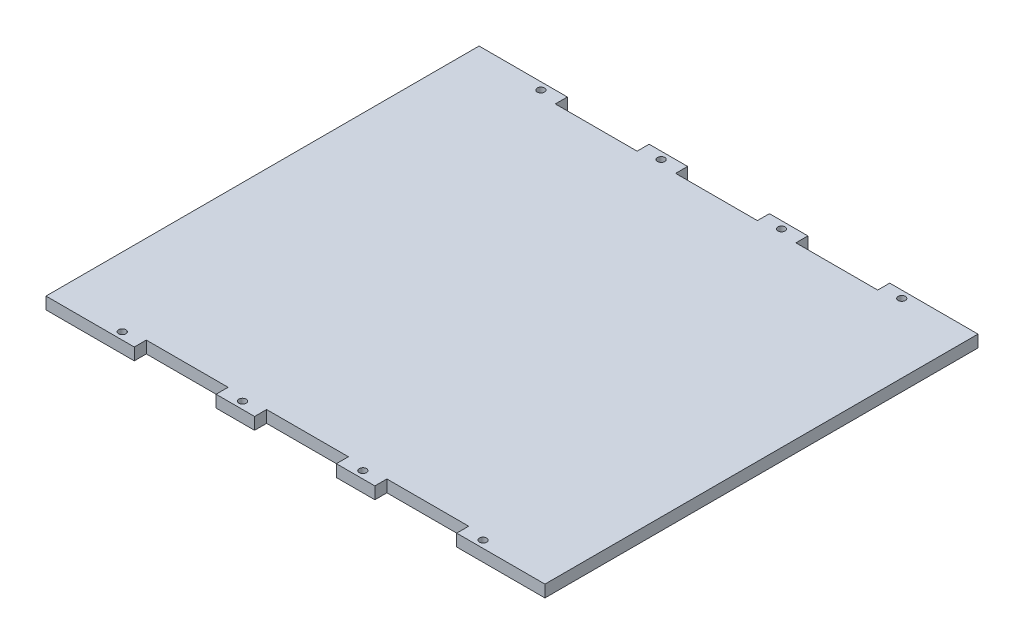
ISO-10303-21;
HEADER;
FILE_DESCRIPTION(('STEP AP214'),'2;1');
FILE_NAME('part.step','',(''),(''),'','','');
FILE_SCHEMA(('AUTOMOTIVE_DESIGN { 1 0 10303 214 1 1 1 1 }'));
ENDSEC;
DATA;
#1=APPLICATION_CONTEXT('core data for automotive mechanical design processes');
#2=APPLICATION_PROTOCOL_DEFINITION('international standard','automotive_design',2000,#1);
#3=PRODUCT_CONTEXT('',#1,'mechanical');
#4=PRODUCT('Part','Part','',(#3));
#5=PRODUCT_RELATED_PRODUCT_CATEGORY('part','',(#4));
#6=PRODUCT_DEFINITION_FORMATION('','',#4);
#7=PRODUCT_DEFINITION_CONTEXT('part definition',#1,'design');
#8=PRODUCT_DEFINITION('design','',#6,#7);
#9=PRODUCT_DEFINITION_SHAPE('','',#8);
#10=(LENGTH_UNIT() NAMED_UNIT(*) SI_UNIT(.MILLI.,.METRE.));
#11=(NAMED_UNIT(*) PLANE_ANGLE_UNIT() SI_UNIT($,.RADIAN.));
#12=(NAMED_UNIT(*) SI_UNIT($,.STERADIAN.) SOLID_ANGLE_UNIT());
#13=UNCERTAINTY_MEASURE_WITH_UNIT(LENGTH_MEASURE(1.E-05),#10,'distance_accuracy_value','');
#14=(GEOMETRIC_REPRESENTATION_CONTEXT(3) GLOBAL_UNCERTAINTY_ASSIGNED_CONTEXT((#13)) GLOBAL_UNIT_ASSIGNED_CONTEXT((#10,
#11,#12)) REPRESENTATION_CONTEXT('',''));
#15=CARTESIAN_POINT('',(0.,0.,0.));
#16=DIRECTION('',(0.,0.,1.));
#17=DIRECTION('',(1.,0.,0.));
#18=AXIS2_PLACEMENT_3D('',#15,#16,#17);
#19=CARTESIAN_POINT('',(0.,5.,0.));
#20=DIRECTION('',(0.,1.,0.));
#21=DIRECTION('',(0.,0.,1.));
#22=AXIS2_PLACEMENT_3D('',#19,#20,#21);
#23=PLANE('',#22);
#24=CARTESIAN_POINT('',(-75.,5.,-87.));
#25=DIRECTION('',(0.,-1.,0.));
#26=DIRECTION('',(0.,0.,-1.));
#27=AXIS2_PLACEMENT_3D('',#24,#25,#26);
#28=CIRCLE('',#27,1.5);
#29=CARTESIAN_POINT('',(-75.,5.,-88.5));
#30=VERTEX_POINT('',#29);
#31=EDGE_CURVE('E273',#30,#30,#28,.T.);
#32=ORIENTED_EDGE('',*,*,#31,.T.);
#33=EDGE_LOOP('',(#32));
#34=FACE_BOUND('',#33,.T.);
#35=CARTESIAN_POINT('',(-25.,5.,-87.));
#36=DIRECTION('',(0.,-1.,0.));
#37=DIRECTION('',(0.,0.,-1.));
#38=AXIS2_PLACEMENT_3D('',#35,#36,#37);
#39=CIRCLE('',#38,1.5);
#40=CARTESIAN_POINT('',(-25.,5.,-88.5));
#41=VERTEX_POINT('',#40);
#42=EDGE_CURVE('E279',#41,#41,#39,.T.);
#43=ORIENTED_EDGE('',*,*,#42,.T.);
#44=EDGE_LOOP('',(#43));
#45=FACE_BOUND('',#44,.T.);
#46=CARTESIAN_POINT('',(25.,5.,-87.));
#47=DIRECTION('',(0.,-1.,0.));
#48=DIRECTION('',(0.,0.,-1.));
#49=AXIS2_PLACEMENT_3D('',#46,#47,#48);
#50=CIRCLE('',#49,1.5);
#51=CARTESIAN_POINT('',(25.,5.,-88.5));
#52=VERTEX_POINT('',#51);
#53=EDGE_CURVE('E285',#52,#52,#50,.T.);
#54=ORIENTED_EDGE('',*,*,#53,.T.);
#55=EDGE_LOOP('',(#54));
#56=FACE_BOUND('',#55,.T.);
#57=CARTESIAN_POINT('',(75.,5.,-87.));
#58=DIRECTION('',(0.,-1.,0.));
#59=DIRECTION('',(0.,0.,-1.));
#60=AXIS2_PLACEMENT_3D('',#57,#58,#59);
#61=CIRCLE('',#60,1.5);
#62=CARTESIAN_POINT('',(75.,5.,-88.5));
#63=VERTEX_POINT('',#62);
#64=EDGE_CURVE('E266',#63,#63,#61,.T.);
#65=ORIENTED_EDGE('',*,*,#64,.T.);
#66=EDGE_LOOP('',(#65));
#67=FACE_BOUND('',#66,.T.);
#68=CARTESIAN_POINT('',(-75.,5.,87.));
#69=DIRECTION('',(0.,1.,0.));
#70=DIRECTION('',(0.,0.,1.));
#71=AXIS2_PLACEMENT_3D('',#68,#69,#70);
#72=CIRCLE('',#71,1.5);
#73=CARTESIAN_POINT('',(-75.,5.,88.5));
#74=VERTEX_POINT('',#73);
#75=EDGE_CURVE('E297',#74,#74,#72,.T.);
#76=ORIENTED_EDGE('',*,*,#75,.F.);
#77=EDGE_LOOP('',(#76));
#78=FACE_BOUND('',#77,.T.);
#79=CARTESIAN_POINT('',(-25.,5.,87.));
#80=DIRECTION('',(0.,1.,0.));
#81=DIRECTION('',(0.,0.,1.));
#82=AXIS2_PLACEMENT_3D('',#79,#80,#81);
#83=CIRCLE('',#82,1.5);
#84=CARTESIAN_POINT('',(-25.,5.,88.5));
#85=VERTEX_POINT('',#84);
#86=EDGE_CURVE('E303',#85,#85,#83,.T.);
#87=ORIENTED_EDGE('',*,*,#86,.F.);
#88=EDGE_LOOP('',(#87));
#89=FACE_BOUND('',#88,.T.);
#90=CARTESIAN_POINT('',(25.,5.,87.));
#91=DIRECTION('',(0.,1.,0.));
#92=DIRECTION('',(0.,0.,1.));
#93=AXIS2_PLACEMENT_3D('',#90,#91,#92);
#94=CIRCLE('',#93,1.5);
#95=CARTESIAN_POINT('',(25.,5.,88.5));
#96=VERTEX_POINT('',#95);
#97=EDGE_CURVE('E309',#96,#96,#94,.T.);
#98=ORIENTED_EDGE('',*,*,#97,.F.);
#99=EDGE_LOOP('',(#98));
#100=FACE_BOUND('',#99,.T.);
#101=CARTESIAN_POINT('',(75.,5.,87.));
#102=DIRECTION('',(0.,1.,0.));
#103=DIRECTION('',(0.,0.,1.));
#104=AXIS2_PLACEMENT_3D('',#101,#102,#103);
#105=CIRCLE('',#104,1.5);
#106=CARTESIAN_POINT('',(75.,5.,88.5));
#107=VERTEX_POINT('',#106);
#108=EDGE_CURVE('E272',#107,#107,#105,.T.);
#109=ORIENTED_EDGE('',*,*,#108,.F.);
#110=EDGE_LOOP('',(#109));
#111=FACE_BOUND('',#110,.T.);
#112=DIRECTION('',(-1.,0.,0.));
#113=VECTOR('',#112,1.);
#114=CARTESIAN_POINT('',(100.,5.,-90.));
#115=LINE('',#114,#113);
#116=CARTESIAN_POINT('',(-67.,5.,-90.));
#117=VERTEX_POINT('',#116);
#118=CARTESIAN_POINT('',(-103.69,5.,-90.));
#119=VERTEX_POINT('',#118);
#120=EDGE_CURVE('E49',#117,#119,#115,.T.);
#121=ORIENTED_EDGE('',*,*,#120,.T.);
#122=DIRECTION('',(0.,0.,-1.));
#123=VECTOR('',#122,1.);
#124=CARTESIAN_POINT('',(-103.69,5.,-90.));
#125=LINE('',#124,#123);
#126=CARTESIAN_POINT('',(-103.69,5.,90.));
#127=VERTEX_POINT('',#126);
#128=EDGE_CURVE('E246',#127,#119,#125,.T.);
#129=ORIENTED_EDGE('',*,*,#128,.F.);
#130=DIRECTION('',(1.,0.,0.));
#131=VECTOR('',#130,1.);
#132=CARTESIAN_POINT('',(100.,5.,90.));
#133=LINE('',#132,#131);
#134=CARTESIAN_POINT('',(-67.,5.,90.));
#135=VERTEX_POINT('',#134);
#136=EDGE_CURVE('E464',#127,#135,#133,.T.);
#137=ORIENTED_EDGE('',*,*,#136,.T.);
#138=DIRECTION('',(0.,0.,-1.));
#139=VECTOR('',#138,1.);
#140=CARTESIAN_POINT('',(-67.0000000000003,5.,1.85962356624714E-13));
#141=LINE('',#140,#139);
#142=CARTESIAN_POINT('',(-67.,5.,85.));
#143=VERTEX_POINT('',#142);
#144=EDGE_CURVE('E434',#135,#143,#141,.T.);
#145=ORIENTED_EDGE('',*,*,#144,.T.);
#146=DIRECTION('',(1.,0.,0.));
#147=VECTOR('',#146,1.);
#148=CARTESIAN_POINT('',(0.,5.,85.));
#149=LINE('',#148,#147);
#150=CARTESIAN_POINT('',(-33.,5.,85.));
#151=VERTEX_POINT('',#150);
#152=EDGE_CURVE('E431',#143,#151,#149,.T.);
#153=ORIENTED_EDGE('',*,*,#152,.T.);
#154=DIRECTION('',(0.,0.,-1.));
#155=VECTOR('',#154,1.);
#156=CARTESIAN_POINT('',(-33.,5.,0.));
#157=LINE('',#156,#155);
#158=CARTESIAN_POINT('',(-33.,5.,90.));
#159=VERTEX_POINT('',#158);
#160=EDGE_CURVE('E425',#159,#151,#157,.T.);
#161=ORIENTED_EDGE('',*,*,#160,.F.);
#162=CARTESIAN_POINT('',(-17.,5.,90.));
#163=VERTEX_POINT('',#162);
#164=EDGE_CURVE('E490',#159,#163,#133,.T.);
#165=ORIENTED_EDGE('',*,*,#164,.T.);
#166=DIRECTION('',(0.,0.,-1.));
#167=VECTOR('',#166,1.);
#168=CARTESIAN_POINT('',(-17.0000000000001,5.,0.));
#169=LINE('',#168,#167);
#170=CARTESIAN_POINT('',(-17.,5.,85.));
#171=VERTEX_POINT('',#170);
#172=EDGE_CURVE('E452',#163,#171,#169,.T.);
#173=ORIENTED_EDGE('',*,*,#172,.T.);
#174=DIRECTION('',(1.,0.,0.));
#175=VECTOR('',#174,1.);
#176=CARTESIAN_POINT('',(0.,5.,85.));
#177=LINE('',#176,#175);
#178=CARTESIAN_POINT('',(17.,5.,85.));
#179=VERTEX_POINT('',#178);
#180=EDGE_CURVE('E406',#171,#179,#177,.T.);
#181=ORIENTED_EDGE('',*,*,#180,.T.);
#182=DIRECTION('',(0.,0.,-1.));
#183=VECTOR('',#182,1.);
#184=CARTESIAN_POINT('',(17.0000000000001,5.,0.));
#185=LINE('',#184,#183);
#186=CARTESIAN_POINT('',(17.,5.,90.));
#187=VERTEX_POINT('',#186);
#188=EDGE_CURVE('E369',#187,#179,#185,.T.);
#189=ORIENTED_EDGE('',*,*,#188,.F.);
#190=CARTESIAN_POINT('',(33.,5.,90.));
#191=VERTEX_POINT('',#190);
#192=EDGE_CURVE('E463',#187,#191,#133,.T.);
#193=ORIENTED_EDGE('',*,*,#192,.T.);
#194=DIRECTION('',(0.,0.,-1.));
#195=VECTOR('',#194,1.);
#196=CARTESIAN_POINT('',(33.,5.,0.));
#197=LINE('',#196,#195);
#198=CARTESIAN_POINT('',(33.,5.,85.));
#199=VERTEX_POINT('',#198);
#200=EDGE_CURVE('E398',#191,#199,#197,.T.);
#201=ORIENTED_EDGE('',*,*,#200,.T.);
#202=DIRECTION('',(-1.,0.,0.));
#203=VECTOR('',#202,1.);
#204=CARTESIAN_POINT('',(0.,5.,85.));
#205=LINE('',#204,#203);
#206=CARTESIAN_POINT('',(67.,5.,85.));
#207=VERTEX_POINT('',#206);
#208=EDGE_CURVE('E395',#207,#199,#205,.T.);
#209=ORIENTED_EDGE('',*,*,#208,.F.);
#210=DIRECTION('',(0.,0.,-1.));
#211=VECTOR('',#210,1.);
#212=CARTESIAN_POINT('',(67.0000000000003,5.,1.85962356624714E-13));
#213=LINE('',#212,#211);
#214=CARTESIAN_POINT('',(67.,5.,90.));
#215=VERTEX_POINT('',#214);
#216=EDGE_CURVE('E389',#215,#207,#213,.T.);
#217=ORIENTED_EDGE('',*,*,#216,.F.);
#218=CARTESIAN_POINT('',(103.69,5.,90.));
#219=VERTEX_POINT('',#218);
#220=EDGE_CURVE('E462',#215,#219,#133,.T.);
#221=ORIENTED_EDGE('',*,*,#220,.T.);
#222=DIRECTION('',(0.,0.,-1.));
#223=VECTOR('',#222,1.);
#224=CARTESIAN_POINT('',(103.69,5.,-90.));
#225=LINE('',#224,#223);
#226=CARTESIAN_POINT('',(103.69,5.,-90.));
#227=VERTEX_POINT('',#226);
#228=EDGE_CURVE('E253',#219,#227,#225,.T.);
#229=ORIENTED_EDGE('',*,*,#228,.T.);
#230=CARTESIAN_POINT('',(67.,5.,-90.));
#231=VERTEX_POINT('',#230);
#232=EDGE_CURVE('E11',#227,#231,#115,.T.);
#233=ORIENTED_EDGE('',*,*,#232,.T.);
#234=DIRECTION('',(0.,0.,1.));
#235=VECTOR('',#234,1.);
#236=CARTESIAN_POINT('',(67.0000000000003,5.,-1.85962356624714E-13));
#237=LINE('',#236,#235);
#238=CARTESIAN_POINT('',(67.,5.,-85.));
#239=VERTEX_POINT('',#238);
#240=EDGE_CURVE('E361',#231,#239,#237,.T.);
#241=ORIENTED_EDGE('',*,*,#240,.T.);
#242=DIRECTION('',(-1.,0.,0.));
#243=VECTOR('',#242,1.);
#244=CARTESIAN_POINT('',(0.,5.,-85.));
#245=LINE('',#244,#243);
#246=CARTESIAN_POINT('',(33.,5.,-85.));
#247=VERTEX_POINT('',#246);
#248=EDGE_CURVE('E358',#239,#247,#245,.T.);
#249=ORIENTED_EDGE('',*,*,#248,.T.);
#250=DIRECTION('',(0.,0.,1.));
#251=VECTOR('',#250,1.);
#252=CARTESIAN_POINT('',(33.,5.,0.));
#253=LINE('',#252,#251);
#254=CARTESIAN_POINT('',(33.,5.,-90.));
#255=VERTEX_POINT('',#254);
#256=EDGE_CURVE('E352',#255,#247,#253,.T.);
#257=ORIENTED_EDGE('',*,*,#256,.F.);
#258=CARTESIAN_POINT('',(17.,5.,-90.));
#259=VERTEX_POINT('',#258);
#260=EDGE_CURVE('E47',#255,#259,#115,.T.);
#261=ORIENTED_EDGE('',*,*,#260,.T.);
#262=DIRECTION('',(0.,0.,1.));
#263=VECTOR('',#262,1.);
#264=CARTESIAN_POINT('',(17.0000000000001,5.,0.));
#265=LINE('',#264,#263);
#266=CARTESIAN_POINT('',(17.,5.,-85.));
#267=VERTEX_POINT('',#266);
#268=EDGE_CURVE('E64',#259,#267,#265,.T.);
#269=ORIENTED_EDGE('',*,*,#268,.T.);
#270=DIRECTION('',(-1.,0.,0.));
#271=VECTOR('',#270,1.);
#272=CARTESIAN_POINT('',(0.,5.,-85.));
#273=LINE('',#272,#271);
#274=CARTESIAN_POINT('',(-17.,5.,-85.));
#275=VERTEX_POINT('',#274);
#276=EDGE_CURVE('E335',#267,#275,#273,.T.);
#277=ORIENTED_EDGE('',*,*,#276,.T.);
#278=DIRECTION('',(0.,0.,1.));
#279=VECTOR('',#278,1.);
#280=CARTESIAN_POINT('',(-17.0000000000001,5.,0.));
#281=LINE('',#280,#279);
#282=CARTESIAN_POINT('',(-17.,5.,-90.));
#283=VERTEX_POINT('',#282);
#284=EDGE_CURVE('E296',#283,#275,#281,.T.);
#285=ORIENTED_EDGE('',*,*,#284,.F.);
#286=CARTESIAN_POINT('',(-33.,5.,-90.));
#287=VERTEX_POINT('',#286);
#288=EDGE_CURVE('E465',#283,#287,#115,.T.);
#289=ORIENTED_EDGE('',*,*,#288,.T.);
#290=DIRECTION('',(0.,0.,1.));
#291=VECTOR('',#290,1.);
#292=CARTESIAN_POINT('',(-33.,5.,0.));
#293=LINE('',#292,#291);
#294=CARTESIAN_POINT('',(-33.,5.,-85.));
#295=VERTEX_POINT('',#294);
#296=EDGE_CURVE('E56',#287,#295,#293,.T.);
#297=ORIENTED_EDGE('',*,*,#296,.T.);
#298=DIRECTION('',(1.,0.,0.));
#299=VECTOR('',#298,1.);
#300=CARTESIAN_POINT('',(0.,5.,-85.));
#301=LINE('',#300,#299);
#302=CARTESIAN_POINT('',(-67.,5.,-85.));
#303=VERTEX_POINT('',#302);
#304=EDGE_CURVE('E326',#303,#295,#301,.T.);
#305=ORIENTED_EDGE('',*,*,#304,.F.);
#306=DIRECTION('',(0.,0.,1.));
#307=VECTOR('',#306,1.);
#308=CARTESIAN_POINT('',(-67.0000000000003,5.,-1.85962356624714E-13));
#309=LINE('',#308,#307);
#310=EDGE_CURVE('E321',#117,#303,#309,.T.);
#311=ORIENTED_EDGE('',*,*,#310,.F.);
#312=EDGE_LOOP('',(#121,#129,#137,#145,#153,#161,#165,#173,#181,#189,#193,#201,#209,#217,#221,
#229,#233,#241,#249,#257,#261,#269,#277,#285,#289,#297,#305,#311));
#313=FACE_BOUND('',#312,.T.);
#314=ADVANCED_FACE('F38',(#34,#45,#56,#67,#78,#89,#100,#111,#313),#23,.T.);
#315=CARTESIAN_POINT('',(0.,0.,0.));
#316=DIRECTION('',(0.,1.,0.));
#317=DIRECTION('',(0.,0.,1.));
#318=AXIS2_PLACEMENT_3D('',#315,#316,#317);
#319=PLANE('',#318);
#320=CARTESIAN_POINT('',(-75.,0.,-87.));
#321=DIRECTION('',(0.,-1.,0.));
#322=DIRECTION('',(0.,0.,-1.));
#323=AXIS2_PLACEMENT_3D('',#320,#321,#322);
#324=CIRCLE('',#323,1.5);
#325=CARTESIAN_POINT('',(-75.,0.,-88.5));
#326=VERTEX_POINT('',#325);
#327=EDGE_CURVE('E269',#326,#326,#324,.T.);
#328=ORIENTED_EDGE('',*,*,#327,.F.);
#329=EDGE_LOOP('',(#328));
#330=FACE_BOUND('',#329,.T.);
#331=CARTESIAN_POINT('',(-25.,0.,-87.));
#332=DIRECTION('',(0.,-1.,0.));
#333=DIRECTION('',(0.,0.,-1.));
#334=AXIS2_PLACEMENT_3D('',#331,#332,#333);
#335=CIRCLE('',#334,1.5);
#336=CARTESIAN_POINT('',(-25.,0.,-88.5));
#337=VERTEX_POINT('',#336);
#338=EDGE_CURVE('E276',#337,#337,#335,.T.);
#339=ORIENTED_EDGE('',*,*,#338,.F.);
#340=EDGE_LOOP('',(#339));
#341=FACE_BOUND('',#340,.T.);
#342=CARTESIAN_POINT('',(25.,0.,-87.));
#343=DIRECTION('',(0.,-1.,0.));
#344=DIRECTION('',(0.,0.,-1.));
#345=AXIS2_PLACEMENT_3D('',#342,#343,#344);
#346=CIRCLE('',#345,1.5);
#347=CARTESIAN_POINT('',(25.,0.,-88.5));
#348=VERTEX_POINT('',#347);
#349=EDGE_CURVE('E282',#348,#348,#346,.T.);
#350=ORIENTED_EDGE('',*,*,#349,.F.);
#351=EDGE_LOOP('',(#350));
#352=FACE_BOUND('',#351,.T.);
#353=CARTESIAN_POINT('',(75.,0.,-87.));
#354=DIRECTION('',(0.,-1.,0.));
#355=DIRECTION('',(0.,0.,-1.));
#356=AXIS2_PLACEMENT_3D('',#353,#354,#355);
#357=CIRCLE('',#356,1.5);
#358=CARTESIAN_POINT('',(75.,0.,-88.5));
#359=VERTEX_POINT('',#358);
#360=EDGE_CURVE('E288',#359,#359,#357,.T.);
#361=ORIENTED_EDGE('',*,*,#360,.F.);
#362=EDGE_LOOP('',(#361));
#363=FACE_BOUND('',#362,.T.);
#364=CARTESIAN_POINT('',(-75.,0.,87.));
#365=DIRECTION('',(0.,1.,0.));
#366=DIRECTION('',(0.,0.,1.));
#367=AXIS2_PLACEMENT_3D('',#364,#365,#366);
#368=CIRCLE('',#367,1.5);
#369=CARTESIAN_POINT('',(-75.,0.,88.5));
#370=VERTEX_POINT('',#369);
#371=EDGE_CURVE('E293',#370,#370,#368,.T.);
#372=ORIENTED_EDGE('',*,*,#371,.T.);
#373=EDGE_LOOP('',(#372));
#374=FACE_BOUND('',#373,.T.);
#375=CARTESIAN_POINT('',(-25.,0.,87.));
#376=DIRECTION('',(0.,1.,0.));
#377=DIRECTION('',(0.,0.,1.));
#378=AXIS2_PLACEMENT_3D('',#375,#376,#377);
#379=CIRCLE('',#378,1.5);
#380=CARTESIAN_POINT('',(-25.,0.,88.5));
#381=VERTEX_POINT('',#380);
#382=EDGE_CURVE('E300',#381,#381,#379,.T.);
#383=ORIENTED_EDGE('',*,*,#382,.T.);
#384=EDGE_LOOP('',(#383));
#385=FACE_BOUND('',#384,.T.);
#386=CARTESIAN_POINT('',(25.,0.,87.));
#387=DIRECTION('',(0.,1.,0.));
#388=DIRECTION('',(0.,0.,1.));
#389=AXIS2_PLACEMENT_3D('',#386,#387,#388);
#390=CIRCLE('',#389,1.5);
#391=CARTESIAN_POINT('',(25.,0.,88.5));
#392=VERTEX_POINT('',#391);
#393=EDGE_CURVE('E306',#392,#392,#390,.T.);
#394=ORIENTED_EDGE('',*,*,#393,.T.);
#395=EDGE_LOOP('',(#394));
#396=FACE_BOUND('',#395,.T.);
#397=CARTESIAN_POINT('',(75.,0.,87.));
#398=DIRECTION('',(0.,1.,0.));
#399=DIRECTION('',(0.,0.,1.));
#400=AXIS2_PLACEMENT_3D('',#397,#398,#399);
#401=CIRCLE('',#400,1.5);
#402=CARTESIAN_POINT('',(75.,0.,88.5));
#403=VERTEX_POINT('',#402);
#404=EDGE_CURVE('E312',#403,#403,#401,.T.);
#405=ORIENTED_EDGE('',*,*,#404,.T.);
#406=EDGE_LOOP('',(#405));
#407=FACE_BOUND('',#406,.T.);
#408=DIRECTION('',(1.,0.,0.));
#409=VECTOR('',#408,1.);
#410=CARTESIAN_POINT('',(100.,0.,90.));
#411=LINE('',#410,#409);
#412=CARTESIAN_POINT('',(-103.69,0.,90.));
#413=VERTEX_POINT('',#412);
#414=CARTESIAN_POINT('',(-67.,0.,90.));
#415=VERTEX_POINT('',#414);
#416=EDGE_CURVE('E236',#413,#415,#411,.T.);
#417=ORIENTED_EDGE('',*,*,#416,.F.);
#418=DIRECTION('',(0.,0.,-1.));
#419=VECTOR('',#418,1.);
#420=CARTESIAN_POINT('',(-103.69,0.,-90.));
#421=LINE('',#420,#419);
#422=CARTESIAN_POINT('',(-103.69,0.,-90.));
#423=VERTEX_POINT('',#422);
#424=EDGE_CURVE('E239',#413,#423,#421,.T.);
#425=ORIENTED_EDGE('',*,*,#424,.T.);
#426=DIRECTION('',(-1.,0.,0.));
#427=VECTOR('',#426,1.);
#428=CARTESIAN_POINT('',(100.,0.,-90.));
#429=LINE('',#428,#427);
#430=CARTESIAN_POINT('',(-67.,0.,-90.));
#431=VERTEX_POINT('',#430);
#432=EDGE_CURVE('E42',#431,#423,#429,.T.);
#433=ORIENTED_EDGE('',*,*,#432,.F.);
#434=DIRECTION('',(0.,0.,1.));
#435=VECTOR('',#434,1.);
#436=CARTESIAN_POINT('',(-67.0000000000003,0.,-1.85962356624714E-13));
#437=LINE('',#436,#435);
#438=CARTESIAN_POINT('',(-67.,0.,-85.));
#439=VERTEX_POINT('',#438);
#440=EDGE_CURVE('E323',#431,#439,#437,.T.);
#441=ORIENTED_EDGE('',*,*,#440,.T.);
#442=DIRECTION('',(1.,0.,0.));
#443=VECTOR('',#442,1.);
#444=CARTESIAN_POINT('',(0.,0.,-85.));
#445=LINE('',#444,#443);
#446=CARTESIAN_POINT('',(-33.,0.,-85.));
#447=VERTEX_POINT('',#446);
#448=EDGE_CURVE('E317',#439,#447,#445,.T.);
#449=ORIENTED_EDGE('',*,*,#448,.T.);
#450=DIRECTION('',(0.,0.,1.));
#451=VECTOR('',#450,1.);
#452=CARTESIAN_POINT('',(-33.,0.,0.));
#453=LINE('',#452,#451);
#454=CARTESIAN_POINT('',(-33.,0.,-90.));
#455=VERTEX_POINT('',#454);
#456=EDGE_CURVE('E320',#455,#447,#453,.T.);
#457=ORIENTED_EDGE('',*,*,#456,.F.);
#458=CARTESIAN_POINT('',(-17.,0.,-90.));
#459=VERTEX_POINT('',#458);
#460=EDGE_CURVE('E235',#459,#455,#429,.T.);
#461=ORIENTED_EDGE('',*,*,#460,.F.);
#462=DIRECTION('',(0.,0.,1.));
#463=VECTOR('',#462,1.);
#464=CARTESIAN_POINT('',(-17.0000000000001,0.,0.));
#465=LINE('',#464,#463);
#466=CARTESIAN_POINT('',(-17.,0.,-85.));
#467=VERTEX_POINT('',#466);
#468=EDGE_CURVE('E340',#459,#467,#465,.T.);
#469=ORIENTED_EDGE('',*,*,#468,.T.);
#470=DIRECTION('',(-1.,0.,0.));
#471=VECTOR('',#470,1.);
#472=CARTESIAN_POINT('',(0.,0.,-85.));
#473=LINE('',#472,#471);
#474=CARTESIAN_POINT('',(17.,0.,-85.));
#475=VERTEX_POINT('',#474);
#476=EDGE_CURVE('E376',#475,#467,#473,.T.);
#477=ORIENTED_EDGE('',*,*,#476,.F.);
#478=DIRECTION('',(0.,0.,1.));
#479=VECTOR('',#478,1.);
#480=CARTESIAN_POINT('',(17.0000000000001,0.,0.));
#481=LINE('',#480,#479);
#482=CARTESIAN_POINT('',(17.,0.,-90.));
#483=VERTEX_POINT('',#482);
#484=EDGE_CURVE('E378',#483,#475,#481,.T.);
#485=ORIENTED_EDGE('',*,*,#484,.F.);
#486=CARTESIAN_POINT('',(33.,0.,-90.));
#487=VERTEX_POINT('',#486);
#488=EDGE_CURVE('E1028',#487,#483,#429,.T.);
#489=ORIENTED_EDGE('',*,*,#488,.F.);
#490=DIRECTION('',(0.,0.,1.));
#491=VECTOR('',#490,1.);
#492=CARTESIAN_POINT('',(33.,0.,0.));
#493=LINE('',#492,#491);
#494=CARTESIAN_POINT('',(33.,0.,-85.));
#495=VERTEX_POINT('',#494);
#496=EDGE_CURVE('E354',#487,#495,#493,.T.);
#497=ORIENTED_EDGE('',*,*,#496,.T.);
#498=DIRECTION('',(-1.,0.,0.));
#499=VECTOR('',#498,1.);
#500=CARTESIAN_POINT('',(0.,0.,-85.));
#501=LINE('',#500,#499);
#502=CARTESIAN_POINT('',(67.,0.,-85.));
#503=VERTEX_POINT('',#502);
#504=EDGE_CURVE('E349',#503,#495,#501,.T.);
#505=ORIENTED_EDGE('',*,*,#504,.F.);
#506=DIRECTION('',(0.,0.,1.));
#507=VECTOR('',#506,1.);
#508=CARTESIAN_POINT('',(67.0000000000003,0.,-1.85962356624714E-13));
#509=LINE('',#508,#507);
#510=CARTESIAN_POINT('',(67.,0.,-90.));
#511=VERTEX_POINT('',#510);
#512=EDGE_CURVE('E351',#511,#503,#509,.T.);
#513=ORIENTED_EDGE('',*,*,#512,.F.);
#514=CARTESIAN_POINT('',(103.69,0.,-90.));
#515=VERTEX_POINT('',#514);
#516=EDGE_CURVE('E237',#515,#511,#429,.T.);
#517=ORIENTED_EDGE('',*,*,#516,.F.);
#518=DIRECTION('',(0.,0.,-1.));
#519=VECTOR('',#518,1.);
#520=CARTESIAN_POINT('',(103.69,0.,-90.));
#521=LINE('',#520,#519);
#522=CARTESIAN_POINT('',(103.69,0.,90.));
#523=VERTEX_POINT('',#522);
#524=EDGE_CURVE('E257',#523,#515,#521,.T.);
#525=ORIENTED_EDGE('',*,*,#524,.F.);
#526=CARTESIAN_POINT('',(67.,0.,90.));
#527=VERTEX_POINT('',#526);
#528=EDGE_CURVE('E442',#527,#523,#411,.T.);
#529=ORIENTED_EDGE('',*,*,#528,.F.);
#530=DIRECTION('',(0.,0.,-1.));
#531=VECTOR('',#530,1.);
#532=CARTESIAN_POINT('',(67.0000000000003,0.,1.85962356624714E-13));
#533=LINE('',#532,#531);
#534=CARTESIAN_POINT('',(67.,0.,85.));
#535=VERTEX_POINT('',#534);
#536=EDGE_CURVE('E391',#527,#535,#533,.T.);
#537=ORIENTED_EDGE('',*,*,#536,.T.);
#538=DIRECTION('',(-1.,0.,0.));
#539=VECTOR('',#538,1.);
#540=CARTESIAN_POINT('',(0.,0.,85.));
#541=LINE('',#540,#539);
#542=CARTESIAN_POINT('',(33.,0.,85.));
#543=VERTEX_POINT('',#542);
#544=EDGE_CURVE('E385',#535,#543,#541,.T.);
#545=ORIENTED_EDGE('',*,*,#544,.T.);
#546=DIRECTION('',(0.,0.,-1.));
#547=VECTOR('',#546,1.);
#548=CARTESIAN_POINT('',(33.,0.,0.));
#549=LINE('',#548,#547);
#550=CARTESIAN_POINT('',(33.,0.,90.));
#551=VERTEX_POINT('',#550);
#552=EDGE_CURVE('E388',#551,#543,#549,.T.);
#553=ORIENTED_EDGE('',*,*,#552,.F.);
#554=CARTESIAN_POINT('',(17.,0.,90.));
#555=VERTEX_POINT('',#554);
#556=EDGE_CURVE('E466',#555,#551,#411,.T.);
#557=ORIENTED_EDGE('',*,*,#556,.F.);
#558=DIRECTION('',(0.,0.,-1.));
#559=VECTOR('',#558,1.);
#560=CARTESIAN_POINT('',(17.0000000000001,0.,0.));
#561=LINE('',#560,#559);
#562=CARTESIAN_POINT('',(17.,0.,85.));
#563=VERTEX_POINT('',#562);
#564=EDGE_CURVE('E413',#555,#563,#561,.T.);
#565=ORIENTED_EDGE('',*,*,#564,.T.);
#566=DIRECTION('',(1.,0.,0.));
#567=VECTOR('',#566,1.);
#568=CARTESIAN_POINT('',(0.,0.,85.));
#569=LINE('',#568,#567);
#570=CARTESIAN_POINT('',(-17.,0.,85.));
#571=VERTEX_POINT('',#570);
#572=EDGE_CURVE('E449',#571,#563,#569,.T.);
#573=ORIENTED_EDGE('',*,*,#572,.F.);
#574=DIRECTION('',(0.,0.,-1.));
#575=VECTOR('',#574,1.);
#576=CARTESIAN_POINT('',(-17.0000000000001,0.,0.));
#577=LINE('',#576,#575);
#578=CARTESIAN_POINT('',(-17.,0.,90.));
#579=VERTEX_POINT('',#578);
#580=EDGE_CURVE('E451',#579,#571,#577,.T.);
#581=ORIENTED_EDGE('',*,*,#580,.F.);
#582=CARTESIAN_POINT('',(-33.,0.,90.));
#583=VERTEX_POINT('',#582);
#584=EDGE_CURVE('E472',#583,#579,#411,.T.);
#585=ORIENTED_EDGE('',*,*,#584,.F.);
#586=DIRECTION('',(0.,0.,-1.));
#587=VECTOR('',#586,1.);
#588=CARTESIAN_POINT('',(-33.,0.,0.));
#589=LINE('',#588,#587);
#590=CARTESIAN_POINT('',(-33.,0.,85.));
#591=VERTEX_POINT('',#590);
#592=EDGE_CURVE('E427',#583,#591,#589,.T.);
#593=ORIENTED_EDGE('',*,*,#592,.T.);
#594=DIRECTION('',(1.,0.,0.));
#595=VECTOR('',#594,1.);
#596=CARTESIAN_POINT('',(0.,0.,85.));
#597=LINE('',#596,#595);
#598=CARTESIAN_POINT('',(-67.,0.,85.));
#599=VERTEX_POINT('',#598);
#600=EDGE_CURVE('E422',#599,#591,#597,.T.);
#601=ORIENTED_EDGE('',*,*,#600,.F.);
#602=DIRECTION('',(0.,0.,-1.));
#603=VECTOR('',#602,1.);
#604=CARTESIAN_POINT('',(-67.0000000000003,0.,1.85962356624714E-13));
#605=LINE('',#604,#603);
#606=EDGE_CURVE('E424',#415,#599,#605,.T.);
#607=ORIENTED_EDGE('',*,*,#606,.F.);
#608=EDGE_LOOP('',(#417,#425,#433,#441,#449,#457,#461,#469,#477,#485,#489,#497,#505,#513,#517,
#525,#529,#537,#545,#553,#557,#565,#573,#581,#585,#593,#601,#607));
#609=FACE_BOUND('',#608,.T.);
#610=ADVANCED_FACE('F240',(#330,#341,#352,#363,#374,#385,#396,#407,#609),#319,.F.);
#611=CARTESIAN_POINT('',(100.,5.,-90.));
#612=DIRECTION('',(0.,0.,1.));
#613=DIRECTION('',(1.,0.,0.));
#614=AXIS2_PLACEMENT_3D('',#611,#612,#613);
#615=PLANE('',#614);
#616=ORIENTED_EDGE('',*,*,#432,.T.);
#617=DIRECTION('',(0.,1.,0.));
#618=VECTOR('',#617,1.);
#619=CARTESIAN_POINT('',(-103.69,0.,-90.));
#620=LINE('',#619,#618);
#621=EDGE_CURVE('E231',#423,#119,#620,.T.);
#622=ORIENTED_EDGE('',*,*,#621,.T.);
#623=ORIENTED_EDGE('',*,*,#120,.F.);
#624=DIRECTION('',(0.,1.,0.));
#625=VECTOR('',#624,1.);
#626=CARTESIAN_POINT('',(-67.,0.,-90.));
#627=LINE('',#626,#625);
#628=EDGE_CURVE('E232',#431,#117,#627,.T.);
#629=ORIENTED_EDGE('',*,*,#628,.F.);
#630=EDGE_LOOP('',(#616,#622,#623,#629));
#631=FACE_BOUND('',#630,.T.);
#632=ADVANCED_FACE('F228',(#631),#615,.F.);
#633=DIRECTION('',(0.,1.,0.));
#634=VECTOR('',#633,1.);
#635=CARTESIAN_POINT('',(-33.,0.,-90.));
#636=LINE('',#635,#634);
#637=EDGE_CURVE('E337',#455,#287,#636,.T.);
#638=ORIENTED_EDGE('',*,*,#637,.T.);
#639=ORIENTED_EDGE('',*,*,#288,.F.);
#640=DIRECTION('',(0.,1.,0.));
#641=VECTOR('',#640,1.);
#642=CARTESIAN_POINT('',(-17.,0.,-90.));
#643=LINE('',#642,#641);
#644=EDGE_CURVE('E343',#459,#283,#643,.T.);
#645=ORIENTED_EDGE('',*,*,#644,.F.);
#646=ORIENTED_EDGE('',*,*,#460,.T.);
#647=EDGE_LOOP('',(#638,#639,#645,#646));
#648=FACE_BOUND('',#647,.T.);
#649=ADVANCED_FACE('F543',(#648),#615,.F.);
#650=ORIENTED_EDGE('',*,*,#232,.F.);
#651=DIRECTION('',(0.,1.,0.));
#652=VECTOR('',#651,1.);
#653=CARTESIAN_POINT('',(103.69,0.,-90.));
#654=LINE('',#653,#652);
#655=EDGE_CURVE('E263',#515,#227,#654,.T.);
#656=ORIENTED_EDGE('',*,*,#655,.F.);
#657=ORIENTED_EDGE('',*,*,#516,.T.);
#658=DIRECTION('',(0.,1.,0.));
#659=VECTOR('',#658,1.);
#660=CARTESIAN_POINT('',(67.,0.,-90.));
#661=LINE('',#660,#659);
#662=EDGE_CURVE('E372',#511,#231,#661,.T.);
#663=ORIENTED_EDGE('',*,*,#662,.T.);
#664=EDGE_LOOP('',(#650,#656,#657,#663));
#665=FACE_BOUND('',#664,.T.);
#666=ADVANCED_FACE('F516',(#665),#615,.F.);
#667=ORIENTED_EDGE('',*,*,#260,.F.);
#668=DIRECTION('',(0.,1.,0.));
#669=VECTOR('',#668,1.);
#670=CARTESIAN_POINT('',(33.,0.,-90.));
#671=LINE('',#670,#669);
#672=EDGE_CURVE('E370',#487,#255,#671,.T.);
#673=ORIENTED_EDGE('',*,*,#672,.F.);
#674=ORIENTED_EDGE('',*,*,#488,.T.);
#675=DIRECTION('',(0.,1.,0.));
#676=VECTOR('',#675,1.);
#677=CARTESIAN_POINT('',(17.,0.,-90.));
#678=LINE('',#677,#676);
#679=EDGE_CURVE('E362',#483,#259,#678,.T.);
#680=ORIENTED_EDGE('',*,*,#679,.T.);
#681=EDGE_LOOP('',(#667,#673,#674,#680));
#682=FACE_BOUND('',#681,.T.);
#683=ADVANCED_FACE('F535',(#682),#615,.F.);
#684=CARTESIAN_POINT('',(100.,5.,90.));
#685=DIRECTION('',(0.,0.,-1.));
#686=DIRECTION('',(-1.,0.,0.));
#687=AXIS2_PLACEMENT_3D('',#684,#685,#686);
#688=PLANE('',#687);
#689=ORIENTED_EDGE('',*,*,#528,.T.);
#690=DIRECTION('',(0.,1.,0.));
#691=VECTOR('',#690,1.);
#692=CARTESIAN_POINT('',(103.69,0.,90.));
#693=LINE('',#692,#691);
#694=EDGE_CURVE('E260',#523,#219,#693,.T.);
#695=ORIENTED_EDGE('',*,*,#694,.T.);
#696=ORIENTED_EDGE('',*,*,#220,.F.);
#697=DIRECTION('',(0.,1.,0.));
#698=VECTOR('',#697,1.);
#699=CARTESIAN_POINT('',(67.,0.,90.));
#700=LINE('',#699,#698);
#701=EDGE_CURVE('E407',#527,#215,#700,.T.);
#702=ORIENTED_EDGE('',*,*,#701,.F.);
#703=EDGE_LOOP('',(#689,#695,#696,#702));
#704=FACE_BOUND('',#703,.T.);
#705=ADVANCED_FACE('F509',(#704),#688,.F.);
#706=DIRECTION('',(0.,1.,0.));
#707=VECTOR('',#706,1.);
#708=CARTESIAN_POINT('',(33.,0.,90.));
#709=LINE('',#708,#707);
#710=EDGE_CURVE('E409',#551,#191,#709,.T.);
#711=ORIENTED_EDGE('',*,*,#710,.T.);
#712=ORIENTED_EDGE('',*,*,#192,.F.);
#713=DIRECTION('',(0.,1.,0.));
#714=VECTOR('',#713,1.);
#715=CARTESIAN_POINT('',(17.,0.,90.));
#716=LINE('',#715,#714);
#717=EDGE_CURVE('E416',#555,#187,#716,.T.);
#718=ORIENTED_EDGE('',*,*,#717,.F.);
#719=ORIENTED_EDGE('',*,*,#556,.T.);
#720=EDGE_LOOP('',(#711,#712,#718,#719));
#721=FACE_BOUND('',#720,.T.);
#722=ADVANCED_FACE('F497',(#721),#688,.F.);
#723=ORIENTED_EDGE('',*,*,#136,.F.);
#724=DIRECTION('',(0.,1.,0.));
#725=VECTOR('',#724,1.);
#726=CARTESIAN_POINT('',(-103.69,0.,90.));
#727=LINE('',#726,#725);
#728=EDGE_CURVE('E251',#413,#127,#727,.T.);
#729=ORIENTED_EDGE('',*,*,#728,.F.);
#730=ORIENTED_EDGE('',*,*,#416,.T.);
#731=DIRECTION('',(0.,1.,0.));
#732=VECTOR('',#731,1.);
#733=CARTESIAN_POINT('',(-67.,0.,90.));
#734=LINE('',#733,#732);
#735=EDGE_CURVE('E445',#415,#135,#734,.T.);
#736=ORIENTED_EDGE('',*,*,#735,.T.);
#737=EDGE_LOOP('',(#723,#729,#730,#736));
#738=FACE_BOUND('',#737,.T.);
#739=ADVANCED_FACE('F40',(#738),#688,.F.);
#740=ORIENTED_EDGE('',*,*,#164,.F.);
#741=DIRECTION('',(0.,1.,0.));
#742=VECTOR('',#741,1.);
#743=CARTESIAN_POINT('',(-33.,0.,90.));
#744=LINE('',#743,#742);
#745=EDGE_CURVE('E443',#583,#159,#744,.T.);
#746=ORIENTED_EDGE('',*,*,#745,.F.);
#747=ORIENTED_EDGE('',*,*,#584,.T.);
#748=DIRECTION('',(0.,1.,0.));
#749=VECTOR('',#748,1.);
#750=CARTESIAN_POINT('',(-17.,0.,90.));
#751=LINE('',#750,#749);
#752=EDGE_CURVE('E435',#579,#163,#751,.T.);
#753=ORIENTED_EDGE('',*,*,#752,.T.);
#754=EDGE_LOOP('',(#740,#746,#747,#753));
#755=FACE_BOUND('',#754,.T.);
#756=ADVANCED_FACE('F479',(#755),#688,.F.);
#757=CARTESIAN_POINT('',(-17.0000000000001,0.,0.));
#758=DIRECTION('',(1.,0.,0.));
#759=DIRECTION('',(0.,0.,-1.));
#760=AXIS2_PLACEMENT_3D('',#757,#758,#759);
#761=PLANE('',#760);
#762=ORIENTED_EDGE('',*,*,#172,.F.);
#763=ORIENTED_EDGE('',*,*,#752,.F.);
#764=ORIENTED_EDGE('',*,*,#580,.T.);
#765=DIRECTION('',(0.,1.,0.));
#766=VECTOR('',#765,1.);
#767=CARTESIAN_POINT('',(-17.,0.,85.));
#768=LINE('',#767,#766);
#769=EDGE_CURVE('E455',#571,#171,#768,.T.);
#770=ORIENTED_EDGE('',*,*,#769,.T.);
#771=EDGE_LOOP('',(#762,#763,#764,#770));
#772=FACE_BOUND('',#771,.T.);
#773=ADVANCED_FACE('F485',(#772),#761,.T.);
#774=CARTESIAN_POINT('',(0.,0.,85.));
#775=DIRECTION('',(0.,0.,1.));
#776=DIRECTION('',(1.,0.,0.));
#777=AXIS2_PLACEMENT_3D('',#774,#775,#776);
#778=PLANE('',#777);
#779=ORIENTED_EDGE('',*,*,#180,.F.);
#780=ORIENTED_EDGE('',*,*,#769,.F.);
#781=ORIENTED_EDGE('',*,*,#572,.T.);
#782=DIRECTION('',(0.,1.,0.));
#783=VECTOR('',#782,1.);
#784=CARTESIAN_POINT('',(17.,0.,85.));
#785=LINE('',#784,#783);
#786=EDGE_CURVE('E399',#563,#179,#785,.T.);
#787=ORIENTED_EDGE('',*,*,#786,.T.);
#788=EDGE_LOOP('',(#779,#780,#781,#787));
#789=FACE_BOUND('',#788,.T.);
#790=ADVANCED_FACE('F576',(#789),#778,.T.);
#791=CARTESIAN_POINT('',(0.,0.,85.));
#792=DIRECTION('',(0.,0.,1.));
#793=DIRECTION('',(1.,0.,0.));
#794=AXIS2_PLACEMENT_3D('',#791,#792,#793);
#795=PLANE('',#794);
#796=ORIENTED_EDGE('',*,*,#152,.F.);
#797=DIRECTION('',(0.,1.,0.));
#798=VECTOR('',#797,1.);
#799=CARTESIAN_POINT('',(-67.,0.,85.));
#800=LINE('',#799,#798);
#801=EDGE_CURVE('E430',#599,#143,#800,.T.);
#802=ORIENTED_EDGE('',*,*,#801,.F.);
#803=ORIENTED_EDGE('',*,*,#600,.T.);
#804=DIRECTION('',(0.,1.,0.));
#805=VECTOR('',#804,1.);
#806=CARTESIAN_POINT('',(-33.,0.,85.));
#807=LINE('',#806,#805);
#808=EDGE_CURVE('E440',#591,#151,#807,.T.);
#809=ORIENTED_EDGE('',*,*,#808,.T.);
#810=EDGE_LOOP('',(#796,#802,#803,#809));
#811=FACE_BOUND('',#810,.T.);
#812=ADVANCED_FACE('F841',(#811),#795,.T.);
#813=CARTESIAN_POINT('',(-33.,0.,0.));
#814=DIRECTION('',(1.,0.,0.));
#815=DIRECTION('',(0.,0.,-1.));
#816=AXIS2_PLACEMENT_3D('',#813,#814,#815);
#817=PLANE('',#816);
#818=ORIENTED_EDGE('',*,*,#160,.T.);
#819=ORIENTED_EDGE('',*,*,#808,.F.);
#820=ORIENTED_EDGE('',*,*,#592,.F.);
#821=ORIENTED_EDGE('',*,*,#745,.T.);
#822=EDGE_LOOP('',(#818,#819,#820,#821));
#823=FACE_BOUND('',#822,.T.);
#824=ADVANCED_FACE('F848',(#823),#817,.F.);
#825=CARTESIAN_POINT('',(-67.0000000000003,0.,1.85962356624714E-13));
#826=DIRECTION('',(1.,0.,0.));
#827=DIRECTION('',(0.,0.,-1.));
#828=AXIS2_PLACEMENT_3D('',#825,#826,#827);
#829=PLANE('',#828);
#830=ORIENTED_EDGE('',*,*,#144,.F.);
#831=ORIENTED_EDGE('',*,*,#735,.F.);
#832=ORIENTED_EDGE('',*,*,#606,.T.);
#833=ORIENTED_EDGE('',*,*,#801,.T.);
#834=EDGE_LOOP('',(#830,#831,#832,#833));
#835=FACE_BOUND('',#834,.T.);
#836=ADVANCED_FACE('F856',(#835),#829,.T.);
#837=CARTESIAN_POINT('',(17.0000000000001,0.,0.));
#838=DIRECTION('',(1.,0.,0.));
#839=DIRECTION('',(0.,0.,-1.));
#840=AXIS2_PLACEMENT_3D('',#837,#838,#839);
#841=PLANE('',#840);
#842=ORIENTED_EDGE('',*,*,#188,.T.);
#843=ORIENTED_EDGE('',*,*,#786,.F.);
#844=ORIENTED_EDGE('',*,*,#564,.F.);
#845=ORIENTED_EDGE('',*,*,#717,.T.);
#846=EDGE_LOOP('',(#842,#843,#844,#845));
#847=FACE_BOUND('',#846,.T.);
#848=ADVANCED_FACE('F864',(#847),#841,.F.);
#849=CARTESIAN_POINT('',(0.,0.,85.));
#850=DIRECTION('',(0.,0.,-1.));
#851=DIRECTION('',(-1.,0.,0.));
#852=AXIS2_PLACEMENT_3D('',#849,#850,#851);
#853=PLANE('',#852);
#854=ORIENTED_EDGE('',*,*,#208,.T.);
#855=DIRECTION('',(0.,1.,0.));
#856=VECTOR('',#855,1.);
#857=CARTESIAN_POINT('',(33.,0.,85.));
#858=LINE('',#857,#856);
#859=EDGE_CURVE('E394',#543,#199,#858,.T.);
#860=ORIENTED_EDGE('',*,*,#859,.F.);
#861=ORIENTED_EDGE('',*,*,#544,.F.);
#862=DIRECTION('',(0.,1.,0.));
#863=VECTOR('',#862,1.);
#864=CARTESIAN_POINT('',(67.,0.,85.));
#865=LINE('',#864,#863);
#866=EDGE_CURVE('E404',#535,#207,#865,.T.);
#867=ORIENTED_EDGE('',*,*,#866,.T.);
#868=EDGE_LOOP('',(#854,#860,#861,#867));
#869=FACE_BOUND('',#868,.T.);
#870=ADVANCED_FACE('F505',(#869),#853,.F.);
#871=CARTESIAN_POINT('',(67.0000000000003,0.,1.85962356624714E-13));
#872=DIRECTION('',(1.,0.,0.));
#873=DIRECTION('',(0.,0.,-1.));
#874=AXIS2_PLACEMENT_3D('',#871,#872,#873);
#875=PLANE('',#874);
#876=ORIENTED_EDGE('',*,*,#216,.T.);
#877=ORIENTED_EDGE('',*,*,#866,.F.);
#878=ORIENTED_EDGE('',*,*,#536,.F.);
#879=ORIENTED_EDGE('',*,*,#701,.T.);
#880=EDGE_LOOP('',(#876,#877,#878,#879));
#881=FACE_BOUND('',#880,.T.);
#882=ADVANCED_FACE('F878',(#881),#875,.F.);
#883=CARTESIAN_POINT('',(33.,0.,0.));
#884=DIRECTION('',(1.,0.,0.));
#885=DIRECTION('',(0.,0.,-1.));
#886=AXIS2_PLACEMENT_3D('',#883,#884,#885);
#887=PLANE('',#886);
#888=ORIENTED_EDGE('',*,*,#200,.F.);
#889=ORIENTED_EDGE('',*,*,#710,.F.);
#890=ORIENTED_EDGE('',*,*,#552,.T.);
#891=ORIENTED_EDGE('',*,*,#859,.T.);
#892=EDGE_LOOP('',(#888,#889,#890,#891));
#893=FACE_BOUND('',#892,.T.);
#894=ADVANCED_FACE('F501',(#893),#887,.T.);
#895=CARTESIAN_POINT('',(17.0000000000001,0.,0.));
#896=DIRECTION('',(-1.,0.,0.));
#897=DIRECTION('',(0.,0.,1.));
#898=AXIS2_PLACEMENT_3D('',#895,#896,#897);
#899=PLANE('',#898);
#900=ORIENTED_EDGE('',*,*,#268,.F.);
#901=ORIENTED_EDGE('',*,*,#679,.F.);
#902=ORIENTED_EDGE('',*,*,#484,.T.);
#903=DIRECTION('',(0.,1.,0.));
#904=VECTOR('',#903,1.);
#905=CARTESIAN_POINT('',(17.,0.,-85.));
#906=LINE('',#905,#904);
#907=EDGE_CURVE('E380',#475,#267,#906,.T.);
#908=ORIENTED_EDGE('',*,*,#907,.T.);
#909=EDGE_LOOP('',(#900,#901,#902,#908));
#910=FACE_BOUND('',#909,.T.);
#911=ADVANCED_FACE('F612',(#910),#899,.T.);
#912=CARTESIAN_POINT('',(0.,0.,-85.));
#913=DIRECTION('',(0.,0.,-1.));
#914=DIRECTION('',(-1.,0.,0.));
#915=AXIS2_PLACEMENT_3D('',#912,#913,#914);
#916=PLANE('',#915);
#917=ORIENTED_EDGE('',*,*,#276,.F.);
#918=ORIENTED_EDGE('',*,*,#907,.F.);
#919=ORIENTED_EDGE('',*,*,#476,.T.);
#920=DIRECTION('',(0.,1.,0.));
#921=VECTOR('',#920,1.);
#922=CARTESIAN_POINT('',(-17.,0.,-85.));
#923=LINE('',#922,#921);
#924=EDGE_CURVE('E329',#467,#275,#923,.T.);
#925=ORIENTED_EDGE('',*,*,#924,.T.);
#926=EDGE_LOOP('',(#917,#918,#919,#925));
#927=FACE_BOUND('',#926,.T.);
#928=ADVANCED_FACE('F617',(#927),#916,.T.);
#929=CARTESIAN_POINT('',(0.,0.,-85.));
#930=DIRECTION('',(0.,0.,-1.));
#931=DIRECTION('',(-1.,0.,0.));
#932=AXIS2_PLACEMENT_3D('',#929,#930,#931);
#933=PLANE('',#932);
#934=ORIENTED_EDGE('',*,*,#248,.F.);
#935=DIRECTION('',(0.,1.,0.));
#936=VECTOR('',#935,1.);
#937=CARTESIAN_POINT('',(67.,0.,-85.));
#938=LINE('',#937,#936);
#939=EDGE_CURVE('E357',#503,#239,#938,.T.);
#940=ORIENTED_EDGE('',*,*,#939,.F.);
#941=ORIENTED_EDGE('',*,*,#504,.T.);
#942=DIRECTION('',(0.,1.,0.));
#943=VECTOR('',#942,1.);
#944=CARTESIAN_POINT('',(33.,0.,-85.));
#945=LINE('',#944,#943);
#946=EDGE_CURVE('E367',#495,#247,#945,.T.);
#947=ORIENTED_EDGE('',*,*,#946,.T.);
#948=EDGE_LOOP('',(#934,#940,#941,#947));
#949=FACE_BOUND('',#948,.T.);
#950=ADVANCED_FACE('F527',(#949),#933,.T.);
#951=CARTESIAN_POINT('',(33.,0.,0.));
#952=DIRECTION('',(-1.,0.,0.));
#953=DIRECTION('',(0.,0.,1.));
#954=AXIS2_PLACEMENT_3D('',#951,#952,#953);
#955=PLANE('',#954);
#956=ORIENTED_EDGE('',*,*,#256,.T.);
#957=ORIENTED_EDGE('',*,*,#946,.F.);
#958=ORIENTED_EDGE('',*,*,#496,.F.);
#959=ORIENTED_EDGE('',*,*,#672,.T.);
#960=EDGE_LOOP('',(#956,#957,#958,#959));
#961=FACE_BOUND('',#960,.T.);
#962=ADVANCED_FACE('F529',(#961),#955,.F.);
#963=CARTESIAN_POINT('',(67.0000000000003,0.,-1.85962356624714E-13));
#964=DIRECTION('',(-1.,0.,0.));
#965=DIRECTION('',(0.,0.,1.));
#966=AXIS2_PLACEMENT_3D('',#963,#964,#965);
#967=PLANE('',#966);
#968=ORIENTED_EDGE('',*,*,#240,.F.);
#969=ORIENTED_EDGE('',*,*,#662,.F.);
#970=ORIENTED_EDGE('',*,*,#512,.T.);
#971=ORIENTED_EDGE('',*,*,#939,.T.);
#972=EDGE_LOOP('',(#968,#969,#970,#971));
#973=FACE_BOUND('',#972,.T.);
#974=ADVANCED_FACE('F520',(#973),#967,.T.);
#975=CARTESIAN_POINT('',(-17.0000000000001,0.,0.));
#976=DIRECTION('',(-1.,0.,0.));
#977=DIRECTION('',(0.,0.,1.));
#978=AXIS2_PLACEMENT_3D('',#975,#976,#977);
#979=PLANE('',#978);
#980=ORIENTED_EDGE('',*,*,#284,.T.);
#981=ORIENTED_EDGE('',*,*,#924,.F.);
#982=ORIENTED_EDGE('',*,*,#468,.F.);
#983=ORIENTED_EDGE('',*,*,#644,.T.);
#984=EDGE_LOOP('',(#980,#981,#982,#983));
#985=FACE_BOUND('',#984,.T.);
#986=ADVANCED_FACE('F563',(#985),#979,.F.);
#987=CARTESIAN_POINT('',(0.,0.,-85.));
#988=DIRECTION('',(0.,0.,1.));
#989=DIRECTION('',(1.,0.,0.));
#990=AXIS2_PLACEMENT_3D('',#987,#988,#989);
#991=PLANE('',#990);
#992=ORIENTED_EDGE('',*,*,#304,.T.);
#993=DIRECTION('',(0.,1.,0.));
#994=VECTOR('',#993,1.);
#995=CARTESIAN_POINT('',(-33.,0.,-85.));
#996=LINE('',#995,#994);
#997=EDGE_CURVE('E325',#447,#295,#996,.T.);
#998=ORIENTED_EDGE('',*,*,#997,.F.);
#999=ORIENTED_EDGE('',*,*,#448,.F.);
#1000=DIRECTION('',(0.,1.,0.));
#1001=VECTOR('',#1000,1.);
#1002=CARTESIAN_POINT('',(-67.,0.,-85.));
#1003=LINE('',#1002,#1001);
#1004=EDGE_CURVE('E333',#439,#303,#1003,.T.);
#1005=ORIENTED_EDGE('',*,*,#1004,.T.);
#1006=EDGE_LOOP('',(#992,#998,#999,#1005));
#1007=FACE_BOUND('',#1006,.T.);
#1008=ADVANCED_FACE('F551',(#1007),#991,.F.);
#1009=CARTESIAN_POINT('',(-67.0000000000003,0.,-1.85962356624714E-13));
#1010=DIRECTION('',(-1.,0.,0.));
#1011=DIRECTION('',(0.,0.,1.));
#1012=AXIS2_PLACEMENT_3D('',#1009,#1010,#1011);
#1013=PLANE('',#1012);
#1014=ORIENTED_EDGE('',*,*,#310,.T.);
#1015=ORIENTED_EDGE('',*,*,#1004,.F.);
#1016=ORIENTED_EDGE('',*,*,#440,.F.);
#1017=ORIENTED_EDGE('',*,*,#628,.T.);
#1018=EDGE_LOOP('',(#1014,#1015,#1016,#1017));
#1019=FACE_BOUND('',#1018,.T.);
#1020=ADVANCED_FACE('F554',(#1019),#1013,.F.);
#1021=CARTESIAN_POINT('',(-33.,0.,0.));
#1022=DIRECTION('',(-1.,0.,0.));
#1023=DIRECTION('',(0.,0.,1.));
#1024=AXIS2_PLACEMENT_3D('',#1021,#1022,#1023);
#1025=PLANE('',#1024);
#1026=ORIENTED_EDGE('',*,*,#296,.F.);
#1027=ORIENTED_EDGE('',*,*,#637,.F.);
#1028=ORIENTED_EDGE('',*,*,#456,.T.);
#1029=ORIENTED_EDGE('',*,*,#997,.T.);
#1030=EDGE_LOOP('',(#1026,#1027,#1028,#1029));
#1031=FACE_BOUND('',#1030,.T.);
#1032=ADVANCED_FACE('F547',(#1031),#1025,.T.);
#1033=CARTESIAN_POINT('',(75.,0.,87.));
#1034=DIRECTION('',(0.,1.,0.));
#1035=DIRECTION('',(0.,0.,1.));
#1036=AXIS2_PLACEMENT_3D('',#1033,#1034,#1035);
#1037=CYLINDRICAL_SURFACE('',#1036,1.5);
#1038=ORIENTED_EDGE('',*,*,#404,.F.);
#1039=EDGE_LOOP('',(#1038));
#1040=FACE_BOUND('',#1039,.T.);
#1041=ORIENTED_EDGE('',*,*,#108,.T.);
#1042=EDGE_LOOP('',(#1041));
#1043=FACE_BOUND('',#1042,.T.);
#1044=ADVANCED_FACE('F561',(#1040,#1043),#1037,.F.);
#1045=CARTESIAN_POINT('',(25.,0.,87.));
#1046=DIRECTION('',(0.,1.,0.));
#1047=DIRECTION('',(0.,0.,1.));
#1048=AXIS2_PLACEMENT_3D('',#1045,#1046,#1047);
#1049=CYLINDRICAL_SURFACE('',#1048,1.5);
#1050=ORIENTED_EDGE('',*,*,#393,.F.);
#1051=EDGE_LOOP('',(#1050));
#1052=FACE_BOUND('',#1051,.T.);
#1053=ORIENTED_EDGE('',*,*,#97,.T.);
#1054=EDGE_LOOP('',(#1053));
#1055=FACE_BOUND('',#1054,.T.);
#1056=ADVANCED_FACE('F691',(#1052,#1055),#1049,.F.);
#1057=CARTESIAN_POINT('',(-25.,0.,87.));
#1058=DIRECTION('',(0.,1.,0.));
#1059=DIRECTION('',(0.,0.,1.));
#1060=AXIS2_PLACEMENT_3D('',#1057,#1058,#1059);
#1061=CYLINDRICAL_SURFACE('',#1060,1.5);
#1062=ORIENTED_EDGE('',*,*,#382,.F.);
#1063=EDGE_LOOP('',(#1062));
#1064=FACE_BOUND('',#1063,.T.);
#1065=ORIENTED_EDGE('',*,*,#86,.T.);
#1066=EDGE_LOOP('',(#1065));
#1067=FACE_BOUND('',#1066,.T.);
#1068=ADVANCED_FACE('F700',(#1064,#1067),#1061,.F.);
#1069=CARTESIAN_POINT('',(-75.,0.,87.));
#1070=DIRECTION('',(0.,1.,0.));
#1071=DIRECTION('',(0.,0.,1.));
#1072=AXIS2_PLACEMENT_3D('',#1069,#1070,#1071);
#1073=CYLINDRICAL_SURFACE('',#1072,1.5);
#1074=ORIENTED_EDGE('',*,*,#371,.F.);
#1075=EDGE_LOOP('',(#1074));
#1076=FACE_BOUND('',#1075,.T.);
#1077=ORIENTED_EDGE('',*,*,#75,.T.);
#1078=EDGE_LOOP('',(#1077));
#1079=FACE_BOUND('',#1078,.T.);
#1080=ADVANCED_FACE('F710',(#1076,#1079),#1073,.F.);
#1081=CARTESIAN_POINT('',(75.,0.,-87.));
#1082=DIRECTION('',(0.,1.,0.));
#1083=DIRECTION('',(0.,0.,1.));
#1084=AXIS2_PLACEMENT_3D('',#1081,#1082,#1083);
#1085=CYLINDRICAL_SURFACE('',#1084,1.5);
#1086=ORIENTED_EDGE('',*,*,#360,.T.);
#1087=EDGE_LOOP('',(#1086));
#1088=FACE_BOUND('',#1087,.T.);
#1089=ORIENTED_EDGE('',*,*,#64,.F.);
#1090=EDGE_LOOP('',(#1089));
#1091=FACE_BOUND('',#1090,.T.);
#1092=ADVANCED_FACE('F720',(#1088,#1091),#1085,.F.);
#1093=CARTESIAN_POINT('',(25.,0.,-87.));
#1094=DIRECTION('',(0.,1.,0.));
#1095=DIRECTION('',(0.,0.,1.));
#1096=AXIS2_PLACEMENT_3D('',#1093,#1094,#1095);
#1097=CYLINDRICAL_SURFACE('',#1096,1.5);
#1098=ORIENTED_EDGE('',*,*,#349,.T.);
#1099=EDGE_LOOP('',(#1098));
#1100=FACE_BOUND('',#1099,.T.);
#1101=ORIENTED_EDGE('',*,*,#53,.F.);
#1102=EDGE_LOOP('',(#1101));
#1103=FACE_BOUND('',#1102,.T.);
#1104=ADVANCED_FACE('F730',(#1100,#1103),#1097,.F.);
#1105=CARTESIAN_POINT('',(-25.,0.,-87.));
#1106=DIRECTION('',(0.,1.,0.));
#1107=DIRECTION('',(0.,0.,1.));
#1108=AXIS2_PLACEMENT_3D('',#1105,#1106,#1107);
#1109=CYLINDRICAL_SURFACE('',#1108,1.5);
#1110=ORIENTED_EDGE('',*,*,#338,.T.);
#1111=EDGE_LOOP('',(#1110));
#1112=FACE_BOUND('',#1111,.T.);
#1113=ORIENTED_EDGE('',*,*,#42,.F.);
#1114=EDGE_LOOP('',(#1113));
#1115=FACE_BOUND('',#1114,.T.);
#1116=ADVANCED_FACE('F740',(#1112,#1115),#1109,.F.);
#1117=CARTESIAN_POINT('',(-75.,0.,-87.));
#1118=DIRECTION('',(0.,1.,0.));
#1119=DIRECTION('',(0.,0.,1.));
#1120=AXIS2_PLACEMENT_3D('',#1117,#1118,#1119);
#1121=CYLINDRICAL_SURFACE('',#1120,1.5);
#1122=ORIENTED_EDGE('',*,*,#327,.T.);
#1123=EDGE_LOOP('',(#1122));
#1124=FACE_BOUND('',#1123,.T.);
#1125=ORIENTED_EDGE('',*,*,#31,.F.);
#1126=EDGE_LOOP('',(#1125));
#1127=FACE_BOUND('',#1126,.T.);
#1128=ADVANCED_FACE('F750',(#1124,#1127),#1121,.F.);
#1129=CARTESIAN_POINT('',(103.69,0.,-90.));
#1130=DIRECTION('',(1.,0.,0.));
#1131=DIRECTION('',(0.,0.,-1.));
#1132=AXIS2_PLACEMENT_3D('',#1129,#1130,#1131);
#1133=PLANE('',#1132);
#1134=ORIENTED_EDGE('',*,*,#228,.F.);
#1135=ORIENTED_EDGE('',*,*,#694,.F.);
#1136=ORIENTED_EDGE('',*,*,#524,.T.);
#1137=ORIENTED_EDGE('',*,*,#655,.T.);
#1138=EDGE_LOOP('',(#1134,#1135,#1136,#1137));
#1139=FACE_BOUND('',#1138,.T.);
#1140=ADVANCED_FACE('F513',(#1139),#1133,.T.);
#1141=CARTESIAN_POINT('',(-103.69,0.,-90.));
#1142=DIRECTION('',(1.,0.,0.));
#1143=DIRECTION('',(0.,0.,-1.));
#1144=AXIS2_PLACEMENT_3D('',#1141,#1142,#1143);
#1145=PLANE('',#1144);
#1146=ORIENTED_EDGE('',*,*,#128,.T.);
#1147=ORIENTED_EDGE('',*,*,#621,.F.);
#1148=ORIENTED_EDGE('',*,*,#424,.F.);
#1149=ORIENTED_EDGE('',*,*,#728,.T.);
#1150=EDGE_LOOP('',(#1146,#1147,#1148,#1149));
#1151=FACE_BOUND('',#1150,.T.);
#1152=ADVANCED_FACE('F249',(#1151),#1145,.F.);
#1153=CLOSED_SHELL('',(#314,#610,#632,#649,#666,#683,#705,#722,#739,#756,#773,#790,#812,#824,
#836,#848,#870,#882,#894,#911,#928,#950,#962,#974,#986,#1008,#1020,#1032,#1044,#1056,#1068,
#1080,#1092,#1104,#1116,#1128,#1140,#1152));
#1154=MANIFOLD_SOLID_BREP('B2',#1153);
#1155=ADVANCED_BREP_SHAPE_REPRESENTATION('',(#18,#1154),#14);
#1156=SHAPE_DEFINITION_REPRESENTATION(#9,#1155);
ENDSEC;
END-ISO-10303-21;
